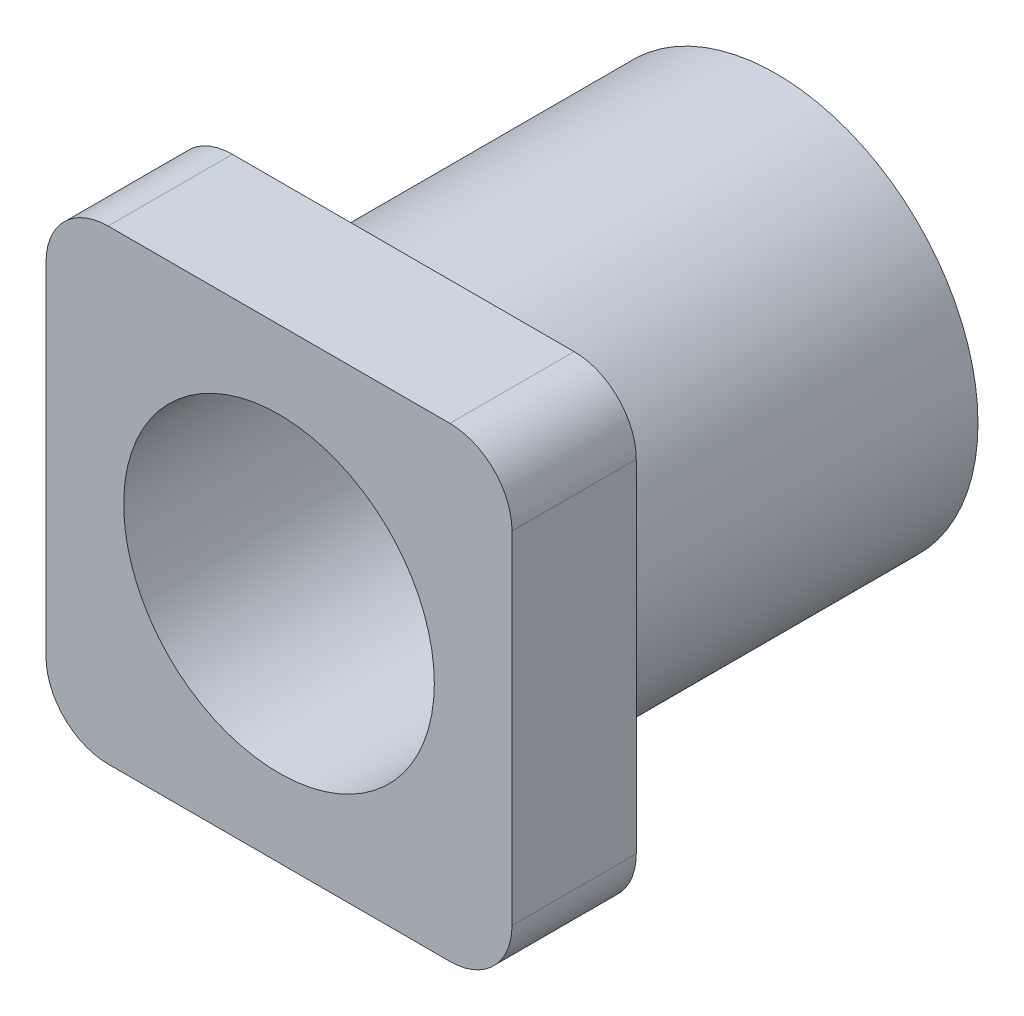
ISO-10303-21;
HEADER;
FILE_DESCRIPTION(('STEP AP214'),'2;1');
FILE_NAME('part.step','',(''),(''),'','','');
FILE_SCHEMA(('AUTOMOTIVE_DESIGN { 1 0 10303 214 1 1 1 1 }'));
ENDSEC;
DATA;
#1=APPLICATION_CONTEXT('core data for automotive mechanical design processes');
#2=APPLICATION_PROTOCOL_DEFINITION('international standard','automotive_design',2000,#1);
#3=PRODUCT_CONTEXT('',#1,'mechanical');
#4=PRODUCT('Part','Part','',(#3));
#5=PRODUCT_RELATED_PRODUCT_CATEGORY('part','',(#4));
#6=PRODUCT_DEFINITION_FORMATION('','',#4);
#7=PRODUCT_DEFINITION_CONTEXT('part definition',#1,'design');
#8=PRODUCT_DEFINITION('design','',#6,#7);
#9=PRODUCT_DEFINITION_SHAPE('','',#8);
#10=(LENGTH_UNIT() NAMED_UNIT(*) SI_UNIT(.MILLI.,.METRE.));
#11=(NAMED_UNIT(*) PLANE_ANGLE_UNIT() SI_UNIT($,.RADIAN.));
#12=(NAMED_UNIT(*) SI_UNIT($,.STERADIAN.) SOLID_ANGLE_UNIT());
#13=UNCERTAINTY_MEASURE_WITH_UNIT(LENGTH_MEASURE(1.E-05),#10,'distance_accuracy_value','');
#14=(GEOMETRIC_REPRESENTATION_CONTEXT(3) GLOBAL_UNCERTAINTY_ASSIGNED_CONTEXT((#13)) GLOBAL_UNIT_ASSIGNED_CONTEXT((#10,
#11,#12)) REPRESENTATION_CONTEXT('',''));
#15=CARTESIAN_POINT('',(0.,0.,0.));
#16=DIRECTION('',(0.,0.,1.));
#17=DIRECTION('',(1.,0.,0.));
#18=AXIS2_PLACEMENT_3D('',#15,#16,#17);
#19=CARTESIAN_POINT('',(9.525,-9.525,-5.08));
#20=DIRECTION('',(1.,0.,0.));
#21=DIRECTION('',(0.,0.,-1.));
#22=AXIS2_PLACEMENT_3D('',#19,#20,#21);
#23=PLANE('',#22);
#24=DIRECTION('',(0.,1.,0.));
#25=VECTOR('',#24,1.);
#26=CARTESIAN_POINT('',(9.525,-9.525,0.));
#27=LINE('',#26,#25);
#28=CARTESIAN_POINT('',(9.525,-6.985,0.));
#29=VERTEX_POINT('',#28);
#30=CARTESIAN_POINT('',(9.525,6.98499999999999,0.));
#31=VERTEX_POINT('',#30);
#32=EDGE_CURVE('E157',#29,#31,#27,.T.);
#33=ORIENTED_EDGE('',*,*,#32,.F.);
#34=DIRECTION('',(0.,0.,1.));
#35=VECTOR('',#34,1.);
#36=CARTESIAN_POINT('',(9.525,-6.985,-5.08));
#37=LINE('',#36,#35);
#38=CARTESIAN_POINT('',(9.525,-6.985,-5.08));
#39=VERTEX_POINT('',#38);
#40=EDGE_CURVE('E138',#29,#39,#37,.F.);
#41=ORIENTED_EDGE('',*,*,#40,.T.);
#42=DIRECTION('',(0.,1.,0.));
#43=VECTOR('',#42,1.);
#44=CARTESIAN_POINT('',(9.525,-9.525,-5.08));
#45=LINE('',#44,#43);
#46=CARTESIAN_POINT('',(9.525,6.98499999999999,-5.08));
#47=VERTEX_POINT('',#46);
#48=EDGE_CURVE('E119',#39,#47,#45,.T.);
#49=ORIENTED_EDGE('',*,*,#48,.T.);
#50=DIRECTION('',(0.,0.,1.));
#51=VECTOR('',#50,1.);
#52=CARTESIAN_POINT('',(9.525,6.985,-5.08));
#53=LINE('',#52,#51);
#54=EDGE_CURVE('E135',#47,#31,#53,.T.);
#55=ORIENTED_EDGE('',*,*,#54,.T.);
#56=EDGE_LOOP('',(#33,#41,#49,#55));
#57=FACE_BOUND('',#56,.T.);
#58=ADVANCED_FACE('F33',(#57),#23,.T.);
#59=CARTESIAN_POINT('',(-9.525,-9.525,-5.08));
#60=DIRECTION('',(0.,-1.,0.));
#61=DIRECTION('',(0.,0.,-1.));
#62=AXIS2_PLACEMENT_3D('',#59,#60,#61);
#63=PLANE('',#62);
#64=DIRECTION('',(1.,0.,0.));
#65=VECTOR('',#64,1.);
#66=CARTESIAN_POINT('',(-9.525,-9.525,-5.08));
#67=LINE('',#66,#65);
#68=CARTESIAN_POINT('',(-6.985,-9.525,-5.08));
#69=VERTEX_POINT('',#68);
#70=CARTESIAN_POINT('',(6.98499999999999,-9.525,-5.08));
#71=VERTEX_POINT('',#70);
#72=EDGE_CURVE('E124',#69,#71,#67,.T.);
#73=ORIENTED_EDGE('',*,*,#72,.T.);
#74=DIRECTION('',(0.,0.,1.));
#75=VECTOR('',#74,1.);
#76=CARTESIAN_POINT('',(6.985,-9.525,-5.08));
#77=LINE('',#76,#75);
#78=CARTESIAN_POINT('',(6.98499999999999,-9.525,0.));
#79=VERTEX_POINT('',#78);
#80=EDGE_CURVE('E118',#71,#79,#77,.T.);
#81=ORIENTED_EDGE('',*,*,#80,.T.);
#82=DIRECTION('',(1.,0.,0.));
#83=VECTOR('',#82,1.);
#84=CARTESIAN_POINT('',(-9.525,-9.525,0.));
#85=LINE('',#84,#83);
#86=CARTESIAN_POINT('',(-6.985,-9.525,0.));
#87=VERTEX_POINT('',#86);
#88=EDGE_CURVE('E101',#87,#79,#85,.T.);
#89=ORIENTED_EDGE('',*,*,#88,.F.);
#90=DIRECTION('',(0.,0.,1.));
#91=VECTOR('',#90,1.);
#92=CARTESIAN_POINT('',(-6.985,-9.525,-5.08));
#93=LINE('',#92,#91);
#94=EDGE_CURVE('E115',#87,#69,#93,.F.);
#95=ORIENTED_EDGE('',*,*,#94,.T.);
#96=EDGE_LOOP('',(#73,#81,#89,#95));
#97=FACE_BOUND('',#96,.T.);
#98=ADVANCED_FACE('F114',(#97),#63,.T.);
#99=CARTESIAN_POINT('',(-9.525,-9.525,-5.08));
#100=DIRECTION('',(-1.,0.,0.));
#101=DIRECTION('',(0.,0.,1.));
#102=AXIS2_PLACEMENT_3D('',#99,#100,#101);
#103=PLANE('',#102);
#104=DIRECTION('',(0.,-1.,0.));
#105=VECTOR('',#104,1.);
#106=CARTESIAN_POINT('',(-9.525,-9.525,-5.08));
#107=LINE('',#106,#105);
#108=CARTESIAN_POINT('',(-9.525,6.98499999999999,-5.08));
#109=VERTEX_POINT('',#108);
#110=CARTESIAN_POINT('',(-9.525,-6.985,-5.08));
#111=VERTEX_POINT('',#110);
#112=EDGE_CURVE('E128',#109,#111,#107,.T.);
#113=ORIENTED_EDGE('',*,*,#112,.T.);
#114=DIRECTION('',(0.,0.,1.));
#115=VECTOR('',#114,1.);
#116=CARTESIAN_POINT('',(-9.525,-6.985,-5.08));
#117=LINE('',#116,#115);
#118=CARTESIAN_POINT('',(-9.525,-6.985,0.));
#119=VERTEX_POINT('',#118);
#120=EDGE_CURVE('E148',#111,#119,#117,.T.);
#121=ORIENTED_EDGE('',*,*,#120,.T.);
#122=DIRECTION('',(0.,-1.,0.));
#123=VECTOR('',#122,1.);
#124=CARTESIAN_POINT('',(-9.525,-9.525,0.));
#125=LINE('',#124,#123);
#126=CARTESIAN_POINT('',(-9.525,6.98499999999999,0.));
#127=VERTEX_POINT('',#126);
#128=EDGE_CURVE('E103',#127,#119,#125,.T.);
#129=ORIENTED_EDGE('',*,*,#128,.F.);
#130=DIRECTION('',(0.,0.,1.));
#131=VECTOR('',#130,1.);
#132=CARTESIAN_POINT('',(-9.525,6.985,-5.08));
#133=LINE('',#132,#131);
#134=EDGE_CURVE('E146',#127,#109,#133,.F.);
#135=ORIENTED_EDGE('',*,*,#134,.T.);
#136=EDGE_LOOP('',(#113,#121,#129,#135));
#137=FACE_BOUND('',#136,.T.);
#138=ADVANCED_FACE('F208',(#137),#103,.T.);
#139=CARTESIAN_POINT('',(-9.525,9.525,-5.08));
#140=DIRECTION('',(0.,1.,0.));
#141=DIRECTION('',(0.,0.,1.));
#142=AXIS2_PLACEMENT_3D('',#139,#140,#141);
#143=PLANE('',#142);
#144=DIRECTION('',(-1.,0.,0.));
#145=VECTOR('',#144,1.);
#146=CARTESIAN_POINT('',(-9.525,9.525,0.));
#147=LINE('',#146,#145);
#148=CARTESIAN_POINT('',(6.98499999999999,9.525,0.));
#149=VERTEX_POINT('',#148);
#150=CARTESIAN_POINT('',(-6.985,9.525,0.));
#151=VERTEX_POINT('',#150);
#152=EDGE_CURVE('E153',#149,#151,#147,.T.);
#153=ORIENTED_EDGE('',*,*,#152,.F.);
#154=DIRECTION('',(0.,0.,1.));
#155=VECTOR('',#154,1.);
#156=CARTESIAN_POINT('',(6.985,9.525,-5.08));
#157=LINE('',#156,#155);
#158=CARTESIAN_POINT('',(6.98499999999999,9.525,-5.08));
#159=VERTEX_POINT('',#158);
#160=EDGE_CURVE('E11',#149,#159,#157,.F.);
#161=ORIENTED_EDGE('',*,*,#160,.T.);
#162=DIRECTION('',(-1.,0.,0.));
#163=VECTOR('',#162,1.);
#164=CARTESIAN_POINT('',(-9.525,9.525,-5.08));
#165=LINE('',#164,#163);
#166=CARTESIAN_POINT('',(-6.985,9.525,-5.08));
#167=VERTEX_POINT('',#166);
#168=EDGE_CURVE('E154',#159,#167,#165,.T.);
#169=ORIENTED_EDGE('',*,*,#168,.T.);
#170=DIRECTION('',(0.,0.,1.));
#171=VECTOR('',#170,1.);
#172=CARTESIAN_POINT('',(-6.985,9.525,-5.08));
#173=LINE('',#172,#171);
#174=EDGE_CURVE('E41',#167,#151,#173,.T.);
#175=ORIENTED_EDGE('',*,*,#174,.T.);
#176=EDGE_LOOP('',(#153,#161,#169,#175));
#177=FACE_BOUND('',#176,.T.);
#178=ADVANCED_FACE('F152',(#177),#143,.T.);
#179=CARTESIAN_POINT('',(0.,0.,-5.08));
#180=DIRECTION('',(0.,0.,-1.));
#181=DIRECTION('',(-1.,0.,0.));
#182=AXIS2_PLACEMENT_3D('',#179,#180,#181);
#183=PLANE('',#182);
#184=CARTESIAN_POINT('',(0.,0.,-5.08));
#185=DIRECTION('',(0.,0.,-1.));
#186=DIRECTION('',(-1.,0.,0.));
#187=AXIS2_PLACEMENT_3D('',#184,#185,#186);
#188=CIRCLE('',#187,8.255);
#189=CARTESIAN_POINT('',(8.255,0.,-5.08));
#190=VERTEX_POINT('',#189);
#191=EDGE_CURVE('E167',#190,#190,#188,.T.);
#192=ORIENTED_EDGE('',*,*,#191,.F.);
#193=EDGE_LOOP('',(#192));
#194=FACE_BOUND('',#193,.T.);
#195=ORIENTED_EDGE('',*,*,#48,.F.);
#196=CARTESIAN_POINT('',(6.985,-6.985,-5.08));
#197=DIRECTION('',(0.,0.,-1.));
#198=DIRECTION('',(-1.,0.,0.));
#199=AXIS2_PLACEMENT_3D('',#196,#197,#198);
#200=CIRCLE('',#199,2.54);
#201=EDGE_CURVE('E144',#39,#71,#200,.T.);
#202=ORIENTED_EDGE('',*,*,#201,.T.);
#203=ORIENTED_EDGE('',*,*,#72,.F.);
#204=CARTESIAN_POINT('',(-6.985,-6.985,-5.08));
#205=DIRECTION('',(0.,0.,-1.));
#206=DIRECTION('',(-1.,0.,0.));
#207=AXIS2_PLACEMENT_3D('',#204,#205,#206);
#208=CIRCLE('',#207,2.54);
#209=EDGE_CURVE('E123',#69,#111,#208,.T.);
#210=ORIENTED_EDGE('',*,*,#209,.T.);
#211=ORIENTED_EDGE('',*,*,#112,.F.);
#212=CARTESIAN_POINT('',(-6.985,6.985,-5.08));
#213=DIRECTION('',(0.,0.,-1.));
#214=DIRECTION('',(-1.,0.,0.));
#215=AXIS2_PLACEMENT_3D('',#212,#213,#214);
#216=CIRCLE('',#215,2.54);
#217=EDGE_CURVE('E48',#109,#167,#216,.T.);
#218=ORIENTED_EDGE('',*,*,#217,.T.);
#219=ORIENTED_EDGE('',*,*,#168,.F.);
#220=CARTESIAN_POINT('',(6.985,6.985,-5.08));
#221=DIRECTION('',(0.,0.,-1.));
#222=DIRECTION('',(-1.,0.,0.));
#223=AXIS2_PLACEMENT_3D('',#220,#221,#222);
#224=CIRCLE('',#223,2.54);
#225=EDGE_CURVE('E141',#159,#47,#224,.T.);
#226=ORIENTED_EDGE('',*,*,#225,.T.);
#227=EDGE_LOOP('',(#195,#202,#203,#210,#211,#218,#219,#226));
#228=FACE_BOUND('',#227,.T.);
#229=ADVANCED_FACE('F191',(#194,#228),#183,.T.);
#230=CARTESIAN_POINT('',(0.,0.,0.));
#231=DIRECTION('',(0.,0.,-1.));
#232=DIRECTION('',(-1.,0.,0.));
#233=AXIS2_PLACEMENT_3D('',#230,#231,#232);
#234=PLANE('',#233);
#235=CARTESIAN_POINT('',(0.,0.,0.));
#236=DIRECTION('',(0.,0.,1.));
#237=DIRECTION('',(1.,0.,0.));
#238=AXIS2_PLACEMENT_3D('',#235,#236,#237);
#239=CIRCLE('',#238,6.35);
#240=CARTESIAN_POINT('',(6.35,0.,0.));
#241=VERTEX_POINT('',#240);
#242=EDGE_CURVE('E173',#241,#241,#239,.T.);
#243=ORIENTED_EDGE('',*,*,#242,.F.);
#244=EDGE_LOOP('',(#243));
#245=FACE_BOUND('',#244,.T.);
#246=ORIENTED_EDGE('',*,*,#88,.T.);
#247=CARTESIAN_POINT('',(6.985,-6.985,0.));
#248=DIRECTION('',(0.,0.,-1.));
#249=DIRECTION('',(-1.,0.,0.));
#250=AXIS2_PLACEMENT_3D('',#247,#248,#249);
#251=CIRCLE('',#250,2.54);
#252=EDGE_CURVE('E108',#79,#29,#251,.F.);
#253=ORIENTED_EDGE('',*,*,#252,.T.);
#254=ORIENTED_EDGE('',*,*,#32,.T.);
#255=CARTESIAN_POINT('',(6.985,6.985,0.));
#256=DIRECTION('',(0.,0.,-1.));
#257=DIRECTION('',(-1.,0.,0.));
#258=AXIS2_PLACEMENT_3D('',#255,#256,#257);
#259=CIRCLE('',#258,2.54);
#260=EDGE_CURVE('E109',#31,#149,#259,.F.);
#261=ORIENTED_EDGE('',*,*,#260,.T.);
#262=ORIENTED_EDGE('',*,*,#152,.T.);
#263=CARTESIAN_POINT('',(-6.985,6.985,0.));
#264=DIRECTION('',(0.,0.,-1.));
#265=DIRECTION('',(-1.,0.,0.));
#266=AXIS2_PLACEMENT_3D('',#263,#264,#265);
#267=CIRCLE('',#266,2.54);
#268=EDGE_CURVE('E126',#151,#127,#267,.F.);
#269=ORIENTED_EDGE('',*,*,#268,.T.);
#270=ORIENTED_EDGE('',*,*,#128,.T.);
#271=CARTESIAN_POINT('',(-6.985,-6.985,0.));
#272=DIRECTION('',(0.,0.,-1.));
#273=DIRECTION('',(-1.,0.,0.));
#274=AXIS2_PLACEMENT_3D('',#271,#272,#273);
#275=CIRCLE('',#274,2.54);
#276=EDGE_CURVE('E98',#119,#87,#275,.F.);
#277=ORIENTED_EDGE('',*,*,#276,.T.);
#278=EDGE_LOOP('',(#246,#253,#254,#261,#262,#269,#270,#277));
#279=FACE_BOUND('',#278,.T.);
#280=ADVANCED_FACE('F100',(#245,#279),#234,.F.);
#281=CARTESIAN_POINT('',(0.,0.,-20.32));
#282=DIRECTION('',(0.,0.,1.));
#283=DIRECTION('',(1.,0.,0.));
#284=AXIS2_PLACEMENT_3D('',#281,#282,#283);
#285=CYLINDRICAL_SURFACE('',#284,8.255);
#286=CARTESIAN_POINT('',(0.,0.,-20.32));
#287=DIRECTION('',(0.,0.,-1.));
#288=DIRECTION('',(-1.,0.,0.));
#289=AXIS2_PLACEMENT_3D('',#286,#287,#288);
#290=CIRCLE('',#289,8.255);
#291=CARTESIAN_POINT('',(8.255,0.,-20.32));
#292=VERTEX_POINT('',#291);
#293=EDGE_CURVE('E159',#292,#292,#290,.T.);
#294=CARTESIAN_POINT('',(8.255,0.,-20.32));
#295=CARTESIAN_POINT('',(8.255,0.,-20.16125));
#296=CARTESIAN_POINT('',(8.255,0.,-20.0025));
#297=CARTESIAN_POINT('',(8.255,0.,-19.685));
#298=CARTESIAN_POINT('',(8.255,0.,-19.52625));
#299=CARTESIAN_POINT('',(8.255,0.,-19.20875));
#300=CARTESIAN_POINT('',(8.255,0.,-19.05));
#301=CARTESIAN_POINT('',(8.255,0.,-18.7325));
#302=CARTESIAN_POINT('',(8.255,0.,-18.57375));
#303=CARTESIAN_POINT('',(8.255,0.,-18.25625));
#304=CARTESIAN_POINT('',(8.255,0.,-18.0975));
#305=CARTESIAN_POINT('',(8.255,0.,-17.78));
#306=CARTESIAN_POINT('',(8.255,0.,-17.62125));
#307=CARTESIAN_POINT('',(8.255,0.,-17.30375));
#308=CARTESIAN_POINT('',(8.255,0.,-17.145));
#309=CARTESIAN_POINT('',(8.255,0.,-16.8275));
#310=CARTESIAN_POINT('',(8.255,0.,-16.66875));
#311=CARTESIAN_POINT('',(8.255,0.,-16.35125));
#312=CARTESIAN_POINT('',(8.255,0.,-16.1925));
#313=CARTESIAN_POINT('',(8.255,0.,-15.875));
#314=CARTESIAN_POINT('',(8.255,0.,-15.71625));
#315=CARTESIAN_POINT('',(8.255,0.,-15.39875));
#316=CARTESIAN_POINT('',(8.255,0.,-15.24));
#317=CARTESIAN_POINT('',(8.255,0.,-14.9225));
#318=CARTESIAN_POINT('',(8.255,0.,-14.76375));
#319=CARTESIAN_POINT('',(8.255,0.,-14.44625));
#320=CARTESIAN_POINT('',(8.255,0.,-14.2875));
#321=CARTESIAN_POINT('',(8.255,0.,-13.97));
#322=CARTESIAN_POINT('',(8.255,0.,-13.81125));
#323=CARTESIAN_POINT('',(8.255,0.,-13.49375));
#324=CARTESIAN_POINT('',(8.255,0.,-13.335));
#325=CARTESIAN_POINT('',(8.255,0.,-13.0175));
#326=CARTESIAN_POINT('',(8.255,0.,-12.85875));
#327=CARTESIAN_POINT('',(8.255,0.,-12.54125));
#328=CARTESIAN_POINT('',(8.255,0.,-12.3825));
#329=CARTESIAN_POINT('',(8.255,0.,-12.065));
#330=CARTESIAN_POINT('',(8.255,0.,-11.90625));
#331=CARTESIAN_POINT('',(8.255,0.,-11.58875));
#332=CARTESIAN_POINT('',(8.255,0.,-11.43));
#333=CARTESIAN_POINT('',(8.255,0.,-11.1125));
#334=CARTESIAN_POINT('',(8.255,0.,-10.95375));
#335=CARTESIAN_POINT('',(8.255,0.,-10.63625));
#336=CARTESIAN_POINT('',(8.255,0.,-10.4775));
#337=CARTESIAN_POINT('',(8.255,0.,-10.16));
#338=CARTESIAN_POINT('',(8.255,0.,-10.00125));
#339=CARTESIAN_POINT('',(8.255,0.,-9.68375));
#340=CARTESIAN_POINT('',(8.255,0.,-9.525));
#341=CARTESIAN_POINT('',(8.255,0.,-9.2075));
#342=CARTESIAN_POINT('',(8.255,0.,-9.04875));
#343=CARTESIAN_POINT('',(8.255,0.,-8.73125));
#344=CARTESIAN_POINT('',(8.255,0.,-8.5725));
#345=CARTESIAN_POINT('',(8.255,0.,-8.255));
#346=CARTESIAN_POINT('',(8.255,0.,-8.09625));
#347=CARTESIAN_POINT('',(8.255,0.,-7.77875));
#348=CARTESIAN_POINT('',(8.255,0.,-7.62));
#349=CARTESIAN_POINT('',(8.255,0.,-7.3025));
#350=CARTESIAN_POINT('',(8.255,0.,-7.14375));
#351=CARTESIAN_POINT('',(8.255,0.,-6.82625));
#352=CARTESIAN_POINT('',(8.255,0.,-6.6675));
#353=CARTESIAN_POINT('',(8.255,0.,-6.35));
#354=CARTESIAN_POINT('',(8.255,0.,-6.19125));
#355=CARTESIAN_POINT('',(8.255,0.,-5.87375));
#356=CARTESIAN_POINT('',(8.255,0.,-5.715));
#357=CARTESIAN_POINT('',(8.255,0.,-5.3975));
#358=CARTESIAN_POINT('',(8.255,0.,-5.23875));
#359=CARTESIAN_POINT('',(8.255,0.,-5.08));
#360=B_SPLINE_CURVE_WITH_KNOTS('',3,(#294,#295,#296,#297,#298,#299,#300,#301,#302,#303,#304,
#305,#306,#307,#308,#309,#310,#311,#312,#313,#314,#315,#316,#317,#318,#319,#320,#321,#322,#323,
#324,#325,#326,#327,#328,#329,#330,#331,#332,#333,#334,#335,#336,#337,#338,#339,#340,#341,#342,
#343,#344,#345,#346,#347,#348,#349,#350,#351,#352,#353,#354,#355,#356,#357,#358,#359),
.UNSPECIFIED.,.F.,.F.,(4,2,2,2,2,2,2,2,2,2,2,2,2,2,2,2,2,2,2,2,2,2,2,2,2,2,2,2,2,2,2,2,4),(0.,
0.476250000000001,0.952500000000002,1.42875,1.905,2.38125,2.8575,3.33375,3.81,4.28625,4.7625,
5.23875,5.715,6.19125,6.6675,7.14375,7.62,8.09625,8.5725,9.04875,9.525,10.00125,10.4775,
10.95375,11.43,11.90625,12.3825,12.85875,13.335,13.81125,14.2875,14.76375,15.24),.UNSPECIFIED.);
#361=EDGE_CURVE('BSEAM190',#292,#190,#360,.T.);
#362=ORIENTED_EDGE('',*,*,#293,.F.);
#363=ORIENTED_EDGE('',*,*,#191,.T.);
#364=ORIENTED_EDGE('',*,*,#361,.T.);
#365=ORIENTED_EDGE('',*,*,#361,.F.);
#366=EDGE_LOOP('',(#362,#364,#363,#365));
#367=FACE_BOUND('',#366,.T.);
#368=ADVANCED_FACE('F190',(#367),#285,.T.);
#369=CARTESIAN_POINT('',(0.,0.,-20.32));
#370=DIRECTION('',(0.,0.,-1.));
#371=DIRECTION('',(-1.,0.,0.));
#372=AXIS2_PLACEMENT_3D('',#369,#370,#371);
#373=PLANE('',#372);
#374=CARTESIAN_POINT('',(0.,0.,-20.32));
#375=DIRECTION('',(0.,0.,1.));
#376=DIRECTION('',(1.,0.,0.));
#377=AXIS2_PLACEMENT_3D('',#374,#375,#376);
#378=CIRCLE('',#377,6.35);
#379=CARTESIAN_POINT('',(6.35,0.,-20.32));
#380=VERTEX_POINT('',#379);
#381=EDGE_CURVE('E170',#380,#380,#378,.T.);
#382=ORIENTED_EDGE('',*,*,#381,.T.);
#383=EDGE_LOOP('',(#382));
#384=FACE_BOUND('',#383,.T.);
#385=ORIENTED_EDGE('',*,*,#293,.T.);
#386=EDGE_LOOP('',(#385));
#387=FACE_BOUND('',#386,.T.);
#388=ADVANCED_FACE('F179',(#384,#387),#373,.T.);
#389=CARTESIAN_POINT('',(0.,0.,-20.32));
#390=DIRECTION('',(0.,0.,1.));
#391=DIRECTION('',(1.,0.,0.));
#392=AXIS2_PLACEMENT_3D('',#389,#390,#391);
#393=CYLINDRICAL_SURFACE('',#392,6.35);
#394=ORIENTED_EDGE('',*,*,#381,.F.);
#395=EDGE_LOOP('',(#394));
#396=FACE_BOUND('',#395,.T.);
#397=ORIENTED_EDGE('',*,*,#242,.T.);
#398=EDGE_LOOP('',(#397));
#399=FACE_BOUND('',#398,.T.);
#400=ADVANCED_FACE('F182',(#396,#399),#393,.F.);
#401=CARTESIAN_POINT('',(6.985,-6.985,-5.08));
#402=DIRECTION('',(0.,0.,1.));
#403=DIRECTION('',(1.,0.,0.));
#404=AXIS2_PLACEMENT_3D('',#401,#402,#403);
#405=CYLINDRICAL_SURFACE('',#404,2.54);
#406=ORIENTED_EDGE('',*,*,#201,.F.);
#407=ORIENTED_EDGE('',*,*,#40,.F.);
#408=ORIENTED_EDGE('',*,*,#252,.F.);
#409=ORIENTED_EDGE('',*,*,#80,.F.);
#410=EDGE_LOOP('',(#406,#407,#408,#409));
#411=FACE_BOUND('',#410,.T.);
#412=ADVANCED_FACE('F185',(#411),#405,.T.);
#413=CARTESIAN_POINT('',(-6.985,-6.985,-5.08));
#414=DIRECTION('',(0.,0.,1.));
#415=DIRECTION('',(1.,0.,0.));
#416=AXIS2_PLACEMENT_3D('',#413,#414,#415);
#417=CYLINDRICAL_SURFACE('',#416,2.54);
#418=ORIENTED_EDGE('',*,*,#209,.F.);
#419=ORIENTED_EDGE('',*,*,#94,.F.);
#420=ORIENTED_EDGE('',*,*,#276,.F.);
#421=ORIENTED_EDGE('',*,*,#120,.F.);
#422=EDGE_LOOP('',(#418,#419,#420,#421));
#423=FACE_BOUND('',#422,.T.);
#424=ADVANCED_FACE('F122',(#423),#417,.T.);
#425=CARTESIAN_POINT('',(6.985,6.985,-5.08));
#426=DIRECTION('',(0.,0.,1.));
#427=DIRECTION('',(1.,0.,0.));
#428=AXIS2_PLACEMENT_3D('',#425,#426,#427);
#429=CYLINDRICAL_SURFACE('',#428,2.54);
#430=ORIENTED_EDGE('',*,*,#225,.F.);
#431=ORIENTED_EDGE('',*,*,#160,.F.);
#432=ORIENTED_EDGE('',*,*,#260,.F.);
#433=ORIENTED_EDGE('',*,*,#54,.F.);
#434=EDGE_LOOP('',(#430,#431,#432,#433));
#435=FACE_BOUND('',#434,.T.);
#436=ADVANCED_FACE('F217',(#435),#429,.T.);
#437=CARTESIAN_POINT('',(-6.985,6.985,-5.08));
#438=DIRECTION('',(0.,0.,1.));
#439=DIRECTION('',(1.,0.,0.));
#440=AXIS2_PLACEMENT_3D('',#437,#438,#439);
#441=CYLINDRICAL_SURFACE('',#440,2.54);
#442=ORIENTED_EDGE('',*,*,#217,.F.);
#443=ORIENTED_EDGE('',*,*,#134,.F.);
#444=ORIENTED_EDGE('',*,*,#268,.F.);
#445=ORIENTED_EDGE('',*,*,#174,.F.);
#446=EDGE_LOOP('',(#442,#443,#444,#445));
#447=FACE_BOUND('',#446,.T.);
#448=ADVANCED_FACE('F35',(#447),#441,.T.);
#449=CLOSED_SHELL('',(#58,#98,#138,#178,#229,#280,#368,#388,#400,#412,#424,#436,#448));
#450=MANIFOLD_SOLID_BREP('B2',#449);
#451=ADVANCED_BREP_SHAPE_REPRESENTATION('',(#18,#450),#14);
#452=SHAPE_DEFINITION_REPRESENTATION(#9,#451);
ENDSEC;
END-ISO-10303-21;
